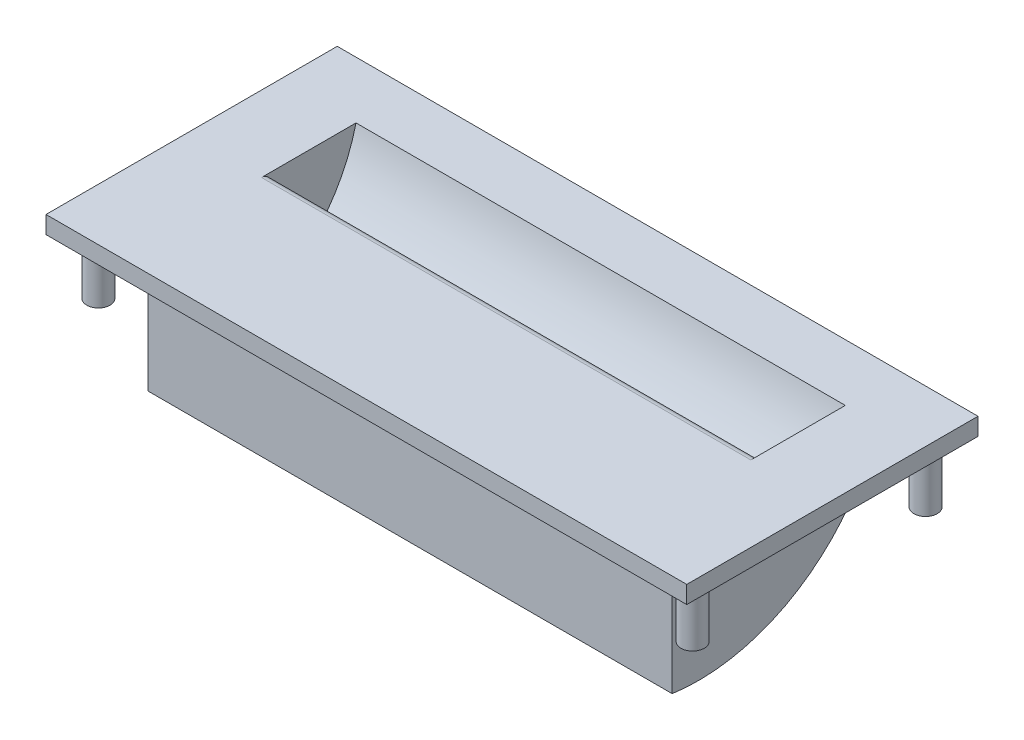
ISO-10303-21;
HEADER;
FILE_DESCRIPTION(('STEP AP214'),'2;1');
FILE_NAME('part.step','',(''),(''),'','','');
FILE_SCHEMA(('AUTOMOTIVE_DESIGN { 1 0 10303 214 1 1 1 1 }'));
ENDSEC;
DATA;
#1=APPLICATION_CONTEXT('core data for automotive mechanical design processes');
#2=APPLICATION_PROTOCOL_DEFINITION('international standard','automotive_design',2000,#1);
#3=PRODUCT_CONTEXT('',#1,'mechanical');
#4=PRODUCT('Part','Part','',(#3));
#5=PRODUCT_RELATED_PRODUCT_CATEGORY('part','',(#4));
#6=PRODUCT_DEFINITION_FORMATION('','',#4);
#7=PRODUCT_DEFINITION_CONTEXT('part definition',#1,'design');
#8=PRODUCT_DEFINITION('design','',#6,#7);
#9=PRODUCT_DEFINITION_SHAPE('','',#8);
#10=(LENGTH_UNIT() NAMED_UNIT(*) SI_UNIT(.MILLI.,.METRE.));
#11=(NAMED_UNIT(*) PLANE_ANGLE_UNIT() SI_UNIT($,.RADIAN.));
#12=(NAMED_UNIT(*) SI_UNIT($,.STERADIAN.) SOLID_ANGLE_UNIT());
#13=UNCERTAINTY_MEASURE_WITH_UNIT(LENGTH_MEASURE(1.E-05),#10,'distance_accuracy_value','');
#14=(GEOMETRIC_REPRESENTATION_CONTEXT(3) GLOBAL_UNCERTAINTY_ASSIGNED_CONTEXT((#13)) GLOBAL_UNIT_ASSIGNED_CONTEXT((#10,
#11,#12)) REPRESENTATION_CONTEXT('',''));
#15=CARTESIAN_POINT('',(0.,0.,0.));
#16=DIRECTION('',(0.,0.,1.));
#17=DIRECTION('',(1.,0.,0.));
#18=AXIS2_PLACEMENT_3D('',#15,#16,#17);
#19=CARTESIAN_POINT('',(-42.,3.,14.5));
#20=DIRECTION('',(0.,0.,1.));
#21=DIRECTION('',(1.,0.,0.));
#22=AXIS2_PLACEMENT_3D('',#19,#20,#21);
#23=PLANE('',#22);
#24=DIRECTION('',(-1.,0.,0.));
#25=VECTOR('',#24,1.);
#26=CARTESIAN_POINT('',(-42.,0.,14.5));
#27=LINE('',#26,#25);
#28=CARTESIAN_POINT('',(42.,0.,14.5));
#29=VERTEX_POINT('',#28);
#30=CARTESIAN_POINT('',(-42.,0.,14.5));
#31=VERTEX_POINT('',#30);
#32=EDGE_CURVE('E256',#29,#31,#27,.T.);
#33=ORIENTED_EDGE('',*,*,#32,.F.);
#34=DIRECTION('',(0.,-1.,0.));
#35=VECTOR('',#34,1.);
#36=CARTESIAN_POINT('',(42.,3.,14.5));
#37=LINE('',#36,#35);
#38=CARTESIAN_POINT('',(42.,-19.2791549046457,14.5));
#39=VERTEX_POINT('',#38);
#40=EDGE_CURVE('E149',#29,#39,#37,.T.);
#41=ORIENTED_EDGE('',*,*,#40,.T.);
#42=DIRECTION('',(1.,0.,0.));
#43=VECTOR('',#42,1.);
#44=CARTESIAN_POINT('',(-42.,-19.2791549046457,14.5));
#45=LINE('',#44,#43);
#46=CARTESIAN_POINT('',(-42.,-19.2791549046457,14.5));
#47=VERTEX_POINT('',#46);
#48=EDGE_CURVE('E142',#47,#39,#45,.T.);
#49=ORIENTED_EDGE('',*,*,#48,.F.);
#50=DIRECTION('',(0.,-1.,0.));
#51=VECTOR('',#50,1.);
#52=CARTESIAN_POINT('',(-42.,3.,14.5));
#53=LINE('',#52,#51);
#54=EDGE_CURVE('E143',#31,#47,#53,.T.);
#55=ORIENTED_EDGE('',*,*,#54,.F.);
#56=EDGE_LOOP('',(#33,#41,#49,#55));
#57=FACE_BOUND('',#56,.T.);
#58=ADVANCED_FACE('F36',(#57),#23,.F.);
#59=CARTESIAN_POINT('',(-42.,9.68203300391323,13.0001350310312));
#60=DIRECTION('',(1.,0.,0.));
#61=DIRECTION('',(0.,0.,-1.));
#62=AXIS2_PLACEMENT_3D('',#59,#60,#61);
#63=PLANE('',#62);
#64=CARTESIAN_POINT('',(-42.,1.5,1.));
#65=DIRECTION('',(1.,0.,0.));
#66=DIRECTION('',(0.,0.,-1.));
#67=AXIS2_PLACEMENT_3D('',#64,#65,#66);
#68=CIRCLE('',#67,1.5);
#69=CARTESIAN_POINT('',(-42.,3.,1.));
#70=VERTEX_POINT('',#69);
#71=CARTESIAN_POINT('',(-42.,1.5,-0.499999999999997));
#72=VERTEX_POINT('',#71);
#73=EDGE_CURVE('E52',#70,#72,#68,.F.);
#74=ORIENTED_EDGE('',*,*,#73,.T.);
#75=CARTESIAN_POINT('',(-42.,1.50000000000001,1.));
#76=DIRECTION('',(1.,0.,0.));
#77=DIRECTION('',(0.,0.,-1.));
#78=AXIS2_PLACEMENT_3D('',#75,#76,#77);
#79=CIRCLE('',#78,1.5);
#80=CARTESIAN_POINT('',(-42.,0.,1.));
#81=VERTEX_POINT('',#80);
#82=EDGE_CURVE('E45',#72,#81,#79,.F.);
#83=ORIENTED_EDGE('',*,*,#82,.T.);
#84=DIRECTION('',(0.,0.,1.));
#85=VECTOR('',#84,1.);
#86=CARTESIAN_POINT('',(-42.,0.,-0.499999999999997));
#87=LINE('',#86,#85);
#88=EDGE_CURVE('E248',#81,#31,#87,.T.);
#89=ORIENTED_EDGE('',*,*,#88,.T.);
#90=ORIENTED_EDGE('',*,*,#54,.T.);
#91=CARTESIAN_POINT('',(-42.,9.68203300391323,13.0001350310312));
#92=DIRECTION('',(1.,0.,0.));
#93=DIRECTION('',(0.,0.,-1.));
#94=AXIS2_PLACEMENT_3D('',#91,#92,#93);
#95=CIRCLE('',#94,29.);
#96=CARTESIAN_POINT('',(-42.,3.,-15.2195466633929));
#97=VERTEX_POINT('',#96);
#98=EDGE_CURVE('E137',#47,#97,#95,.T.);
#99=ORIENTED_EDGE('',*,*,#98,.T.);
#100=DIRECTION('',(0.,0.,1.));
#101=VECTOR('',#100,1.);
#102=CARTESIAN_POINT('',(-42.,3.,-15.2195466633929));
#103=LINE('',#102,#101);
#104=EDGE_CURVE('E146',#97,#70,#103,.T.);
#105=ORIENTED_EDGE('',*,*,#104,.T.);
#106=EDGE_LOOP('',(#74,#83,#89,#90,#99,#105));
#107=FACE_BOUND('',#106,.T.);
#108=ADVANCED_FACE('F145',(#107),#63,.T.);
#109=CARTESIAN_POINT('',(42.,9.68203300391323,13.0001350310312));
#110=DIRECTION('',(1.,0.,0.));
#111=DIRECTION('',(0.,0.,-1.));
#112=AXIS2_PLACEMENT_3D('',#109,#110,#111);
#113=PLANE('',#112);
#114=DIRECTION('',(0.,0.,1.));
#115=VECTOR('',#114,1.);
#116=CARTESIAN_POINT('',(42.,0.,-0.499999999999997));
#117=LINE('',#116,#115);
#118=CARTESIAN_POINT('',(42.,0.,1.));
#119=VERTEX_POINT('',#118);
#120=EDGE_CURVE('E161',#119,#29,#117,.T.);
#121=ORIENTED_EDGE('',*,*,#120,.F.);
#122=CARTESIAN_POINT('',(42.,1.5,1.));
#123=DIRECTION('',(1.,0.,0.));
#124=DIRECTION('',(0.,0.,-1.));
#125=AXIS2_PLACEMENT_3D('',#122,#123,#124);
#126=CIRCLE('',#125,1.5);
#127=CARTESIAN_POINT('',(42.,1.5,-0.499999999999997));
#128=VERTEX_POINT('',#127);
#129=EDGE_CURVE('E11',#119,#128,#126,.T.);
#130=ORIENTED_EDGE('',*,*,#129,.T.);
#131=CARTESIAN_POINT('',(42.,1.5,1.));
#132=DIRECTION('',(1.,0.,0.));
#133=DIRECTION('',(0.,0.,-1.));
#134=AXIS2_PLACEMENT_3D('',#131,#132,#133);
#135=CIRCLE('',#134,1.5);
#136=CARTESIAN_POINT('',(42.,3.,1.));
#137=VERTEX_POINT('',#136);
#138=EDGE_CURVE('E244',#128,#137,#135,.T.);
#139=ORIENTED_EDGE('',*,*,#138,.T.);
#140=DIRECTION('',(0.,0.,1.));
#141=VECTOR('',#140,1.);
#142=CARTESIAN_POINT('',(42.,3.,-15.2195466633929));
#143=LINE('',#142,#141);
#144=CARTESIAN_POINT('',(42.,3.,-15.2195466633929));
#145=VERTEX_POINT('',#144);
#146=EDGE_CURVE('E160',#145,#137,#143,.T.);
#147=ORIENTED_EDGE('',*,*,#146,.F.);
#148=CARTESIAN_POINT('',(42.,9.68203300391323,13.0001350310312));
#149=DIRECTION('',(1.,0.,0.));
#150=DIRECTION('',(0.,0.,-1.));
#151=AXIS2_PLACEMENT_3D('',#148,#149,#150);
#152=CIRCLE('',#151,29.);
#153=EDGE_CURVE('E139',#39,#145,#152,.T.);
#154=ORIENTED_EDGE('',*,*,#153,.F.);
#155=ORIENTED_EDGE('',*,*,#40,.F.);
#156=EDGE_LOOP('',(#121,#130,#139,#147,#154,#155));
#157=FACE_BOUND('',#156,.T.);
#158=ADVANCED_FACE('F261',(#157),#113,.F.);
#159=CARTESIAN_POINT('',(0.,3.,0.));
#160=DIRECTION('',(0.,-1.,0.));
#161=DIRECTION('',(0.,0.,-1.));
#162=AXIS2_PLACEMENT_3D('',#159,#160,#161);
#163=PLANE('',#162);
#164=DIRECTION('',(0.,0.,-1.));
#165=VECTOR('',#164,1.);
#166=CARTESIAN_POINT('',(55.,3.,25.));
#167=LINE('',#166,#165);
#168=CARTESIAN_POINT('',(55.,3.,25.));
#169=VERTEX_POINT('',#168);
#170=CARTESIAN_POINT('',(55.,3.,-25.));
#171=VERTEX_POINT('',#170);
#172=EDGE_CURVE('E212',#169,#171,#167,.T.);
#173=ORIENTED_EDGE('',*,*,#172,.T.);
#174=DIRECTION('',(-1.,0.,0.));
#175=VECTOR('',#174,1.);
#176=CARTESIAN_POINT('',(-55.,3.,-25.));
#177=LINE('',#176,#175);
#178=CARTESIAN_POINT('',(-55.,3.,-25.));
#179=VERTEX_POINT('',#178);
#180=EDGE_CURVE('E215',#171,#179,#177,.T.);
#181=ORIENTED_EDGE('',*,*,#180,.T.);
#182=DIRECTION('',(0.,0.,1.));
#183=VECTOR('',#182,1.);
#184=CARTESIAN_POINT('',(-55.,3.,25.));
#185=LINE('',#184,#183);
#186=CARTESIAN_POINT('',(-55.,3.,25.));
#187=VERTEX_POINT('',#186);
#188=EDGE_CURVE('E218',#179,#187,#185,.T.);
#189=ORIENTED_EDGE('',*,*,#188,.T.);
#190=DIRECTION('',(1.,0.,0.));
#191=VECTOR('',#190,1.);
#192=CARTESIAN_POINT('',(-55.,3.,25.));
#193=LINE('',#192,#191);
#194=EDGE_CURVE('E220',#187,#169,#193,.T.);
#195=ORIENTED_EDGE('',*,*,#194,.T.);
#196=EDGE_LOOP('',(#173,#181,#189,#195));
#197=FACE_BOUND('',#196,.T.);
#198=ORIENTED_EDGE('',*,*,#146,.T.);
#199=DIRECTION('',(1.,0.,0.));
#200=VECTOR('',#199,1.);
#201=CARTESIAN_POINT('',(0.,3.,1.));
#202=LINE('',#201,#200);
#203=EDGE_CURVE('E154',#137,#70,#202,.F.);
#204=ORIENTED_EDGE('',*,*,#203,.T.);
#205=ORIENTED_EDGE('',*,*,#104,.F.);
#206=DIRECTION('',(1.,0.,0.));
#207=VECTOR('',#206,1.);
#208=CARTESIAN_POINT('',(-42.,3.,-15.2195466633929));
#209=LINE('',#208,#207);
#210=EDGE_CURVE('E133',#97,#145,#209,.T.);
#211=ORIENTED_EDGE('',*,*,#210,.T.);
#212=EDGE_LOOP('',(#198,#204,#205,#211));
#213=FACE_BOUND('',#212,.T.);
#214=ADVANCED_FACE('F152',(#197,#213),#163,.F.);
#215=CARTESIAN_POINT('',(55.,3.,25.));
#216=DIRECTION('',(-1.,0.,0.));
#217=DIRECTION('',(0.,0.,1.));
#218=AXIS2_PLACEMENT_3D('',#215,#216,#217);
#219=PLANE('',#218);
#220=DIRECTION('',(0.,0.,-1.));
#221=VECTOR('',#220,1.);
#222=CARTESIAN_POINT('',(55.,0.,25.));
#223=LINE('',#222,#221);
#224=CARTESIAN_POINT('',(55.,0.,25.));
#225=VERTEX_POINT('',#224);
#226=CARTESIAN_POINT('',(55.,0.,-25.));
#227=VERTEX_POINT('',#226);
#228=EDGE_CURVE('E211',#225,#227,#223,.T.);
#229=ORIENTED_EDGE('',*,*,#228,.T.);
#230=DIRECTION('',(0.,-1.,0.));
#231=VECTOR('',#230,1.);
#232=CARTESIAN_POINT('',(55.,3.,-25.));
#233=LINE('',#232,#231);
#234=EDGE_CURVE('E238',#171,#227,#233,.T.);
#235=ORIENTED_EDGE('',*,*,#234,.F.);
#236=ORIENTED_EDGE('',*,*,#172,.F.);
#237=DIRECTION('',(0.,-1.,0.));
#238=VECTOR('',#237,1.);
#239=CARTESIAN_POINT('',(55.,3.,25.));
#240=LINE('',#239,#238);
#241=EDGE_CURVE('E222',#169,#225,#240,.T.);
#242=ORIENTED_EDGE('',*,*,#241,.T.);
#243=EDGE_LOOP('',(#229,#235,#236,#242));
#244=FACE_BOUND('',#243,.T.);
#245=ADVANCED_FACE('F326',(#244),#219,.F.);
#246=CARTESIAN_POINT('',(-55.,3.,-25.));
#247=DIRECTION('',(0.,0.,1.));
#248=DIRECTION('',(1.,0.,0.));
#249=AXIS2_PLACEMENT_3D('',#246,#247,#248);
#250=PLANE('',#249);
#251=DIRECTION('',(-1.,0.,0.));
#252=VECTOR('',#251,1.);
#253=CARTESIAN_POINT('',(-55.,0.,-25.));
#254=LINE('',#253,#252);
#255=CARTESIAN_POINT('',(-55.,0.,-25.));
#256=VERTEX_POINT('',#255);
#257=EDGE_CURVE('E225',#227,#256,#254,.T.);
#258=ORIENTED_EDGE('',*,*,#257,.T.);
#259=DIRECTION('',(0.,-1.,0.));
#260=VECTOR('',#259,1.);
#261=CARTESIAN_POINT('',(-55.,3.,-25.));
#262=LINE('',#261,#260);
#263=EDGE_CURVE('E235',#179,#256,#262,.T.);
#264=ORIENTED_EDGE('',*,*,#263,.F.);
#265=ORIENTED_EDGE('',*,*,#180,.F.);
#266=ORIENTED_EDGE('',*,*,#234,.T.);
#267=EDGE_LOOP('',(#258,#264,#265,#266));
#268=FACE_BOUND('',#267,.T.);
#269=ADVANCED_FACE('F338',(#268),#250,.F.);
#270=CARTESIAN_POINT('',(-55.,3.,25.));
#271=DIRECTION('',(1.,0.,0.));
#272=DIRECTION('',(0.,0.,-1.));
#273=AXIS2_PLACEMENT_3D('',#270,#271,#272);
#274=PLANE('',#273);
#275=DIRECTION('',(0.,0.,1.));
#276=VECTOR('',#275,1.);
#277=CARTESIAN_POINT('',(-55.,0.,25.));
#278=LINE('',#277,#276);
#279=CARTESIAN_POINT('',(-55.,0.,25.));
#280=VERTEX_POINT('',#279);
#281=EDGE_CURVE('E227',#256,#280,#278,.T.);
#282=ORIENTED_EDGE('',*,*,#281,.T.);
#283=DIRECTION('',(0.,-1.,0.));
#284=VECTOR('',#283,1.);
#285=CARTESIAN_POINT('',(-55.,3.,25.));
#286=LINE('',#285,#284);
#287=EDGE_CURVE('E232',#187,#280,#286,.T.);
#288=ORIENTED_EDGE('',*,*,#287,.F.);
#289=ORIENTED_EDGE('',*,*,#188,.F.);
#290=ORIENTED_EDGE('',*,*,#263,.T.);
#291=EDGE_LOOP('',(#282,#288,#289,#290));
#292=FACE_BOUND('',#291,.T.);
#293=ADVANCED_FACE('F334',(#292),#274,.F.);
#294=CARTESIAN_POINT('',(-55.,3.,25.));
#295=DIRECTION('',(0.,0.,-1.));
#296=DIRECTION('',(-1.,0.,0.));
#297=AXIS2_PLACEMENT_3D('',#294,#295,#296);
#298=PLANE('',#297);
#299=DIRECTION('',(1.,0.,0.));
#300=VECTOR('',#299,1.);
#301=CARTESIAN_POINT('',(-55.,0.,25.));
#302=LINE('',#301,#300);
#303=EDGE_CURVE('E216',#280,#225,#302,.T.);
#304=ORIENTED_EDGE('',*,*,#303,.T.);
#305=ORIENTED_EDGE('',*,*,#241,.F.);
#306=ORIENTED_EDGE('',*,*,#194,.F.);
#307=ORIENTED_EDGE('',*,*,#287,.T.);
#308=EDGE_LOOP('',(#304,#305,#306,#307));
#309=FACE_BOUND('',#308,.T.);
#310=ADVANCED_FACE('F330',(#309),#298,.F.);
#311=CARTESIAN_POINT('',(0.,0.,0.));
#312=DIRECTION('',(0.,-1.,0.));
#313=DIRECTION('',(0.,0.,-1.));
#314=AXIS2_PLACEMENT_3D('',#311,#312,#313);
#315=PLANE('',#314);
#316=CARTESIAN_POINT('',(51.,0.,-20.));
#317=DIRECTION('',(0.,-1.,0.));
#318=DIRECTION('',(0.,0.,-1.));
#319=AXIS2_PLACEMENT_3D('',#316,#317,#318);
#320=CIRCLE('',#319,2.);
#321=CARTESIAN_POINT('',(51.,0.,-22.));
#322=VERTEX_POINT('',#321);
#323=EDGE_CURVE('E164',#322,#322,#320,.T.);
#324=ORIENTED_EDGE('',*,*,#323,.F.);
#325=EDGE_LOOP('',(#324));
#326=FACE_BOUND('',#325,.T.);
#327=CARTESIAN_POINT('',(51.,0.,20.));
#328=DIRECTION('',(0.,-1.,0.));
#329=DIRECTION('',(0.,0.,1.));
#330=AXIS2_PLACEMENT_3D('',#327,#328,#329);
#331=CIRCLE('',#330,2.00000000000002);
#332=CARTESIAN_POINT('',(51.,0.,22.));
#333=VERTEX_POINT('',#332);
#334=EDGE_CURVE('E169',#333,#333,#331,.T.);
#335=ORIENTED_EDGE('',*,*,#334,.F.);
#336=EDGE_LOOP('',(#335));
#337=FACE_BOUND('',#336,.T.);
#338=CARTESIAN_POINT('',(-51.,0.,-20.));
#339=DIRECTION('',(0.,-1.,0.));
#340=DIRECTION('',(0.,0.,1.));
#341=AXIS2_PLACEMENT_3D('',#338,#339,#340);
#342=CIRCLE('',#341,2.);
#343=CARTESIAN_POINT('',(-51.,0.,-18.));
#344=VERTEX_POINT('',#343);
#345=EDGE_CURVE('E175',#344,#344,#342,.T.);
#346=ORIENTED_EDGE('',*,*,#345,.F.);
#347=EDGE_LOOP('',(#346));
#348=FACE_BOUND('',#347,.T.);
#349=CARTESIAN_POINT('',(-51.,0.,20.));
#350=DIRECTION('',(0.,-1.,0.));
#351=DIRECTION('',(0.,0.,-1.));
#352=AXIS2_PLACEMENT_3D('',#349,#350,#351);
#353=CIRCLE('',#352,2.);
#354=CARTESIAN_POINT('',(-51.,0.,18.));
#355=VERTEX_POINT('',#354);
#356=EDGE_CURVE('E181',#355,#355,#353,.T.);
#357=ORIENTED_EDGE('',*,*,#356,.F.);
#358=EDGE_LOOP('',(#357));
#359=FACE_BOUND('',#358,.T.);
#360=DIRECTION('',(0.,0.,1.));
#361=VECTOR('',#360,1.);
#362=CARTESIAN_POINT('',(45.,0.,-17.5));
#363=LINE('',#362,#361);
#364=CARTESIAN_POINT('',(45.,0.,-17.5));
#365=VERTEX_POINT('',#364);
#366=CARTESIAN_POINT('',(45.,0.,17.5));
#367=VERTEX_POINT('',#366);
#368=EDGE_CURVE('E190',#365,#367,#363,.T.);
#369=ORIENTED_EDGE('',*,*,#368,.F.);
#370=DIRECTION('',(-1.,0.,0.));
#371=VECTOR('',#370,1.);
#372=CARTESIAN_POINT('',(45.,0.,-17.5));
#373=LINE('',#372,#371);
#374=CARTESIAN_POINT('',(-45.,0.,-17.5));
#375=VERTEX_POINT('',#374);
#376=EDGE_CURVE('E198',#365,#375,#373,.T.);
#377=ORIENTED_EDGE('',*,*,#376,.T.);
#378=DIRECTION('',(0.,0.,1.));
#379=VECTOR('',#378,1.);
#380=CARTESIAN_POINT('',(-45.,0.,-17.5));
#381=LINE('',#380,#379);
#382=CARTESIAN_POINT('',(-45.,0.,17.5));
#383=VERTEX_POINT('',#382);
#384=EDGE_CURVE('E187',#375,#383,#381,.T.);
#385=ORIENTED_EDGE('',*,*,#384,.T.);
#386=DIRECTION('',(-1.,0.,0.));
#387=VECTOR('',#386,1.);
#388=CARTESIAN_POINT('',(45.,0.,17.5));
#389=LINE('',#388,#387);
#390=EDGE_CURVE('E209',#367,#383,#389,.T.);
#391=ORIENTED_EDGE('',*,*,#390,.F.);
#392=EDGE_LOOP('',(#369,#377,#385,#391));
#393=FACE_BOUND('',#392,.T.);
#394=ORIENTED_EDGE('',*,*,#228,.F.);
#395=ORIENTED_EDGE('',*,*,#303,.F.);
#396=ORIENTED_EDGE('',*,*,#281,.F.);
#397=ORIENTED_EDGE('',*,*,#257,.F.);
#398=EDGE_LOOP('',(#394,#395,#396,#397));
#399=FACE_BOUND('',#398,.T.);
#400=ADVANCED_FACE('F322',(#326,#337,#348,#359,#393,#399),#315,.T.);
#401=CARTESIAN_POINT('',(45.,0.,17.5));
#402=DIRECTION('',(0.,0.,-1.));
#403=DIRECTION('',(-1.,0.,0.));
#404=AXIS2_PLACEMENT_3D('',#401,#402,#403);
#405=PLANE('',#404);
#406=DIRECTION('',(0.,-1.,0.));
#407=VECTOR('',#406,1.);
#408=CARTESIAN_POINT('',(-45.,0.,17.5));
#409=LINE('',#408,#407);
#410=CARTESIAN_POINT('',(-45.,-22.,17.5));
#411=VERTEX_POINT('',#410);
#412=EDGE_CURVE('E201',#383,#411,#409,.T.);
#413=ORIENTED_EDGE('',*,*,#412,.T.);
#414=DIRECTION('',(-1.,0.,0.));
#415=VECTOR('',#414,1.);
#416=CARTESIAN_POINT('',(45.,-22.,17.5));
#417=LINE('',#416,#415);
#418=CARTESIAN_POINT('',(45.,-22.,17.5));
#419=VERTEX_POINT('',#418);
#420=EDGE_CURVE('E206',#419,#411,#417,.T.);
#421=ORIENTED_EDGE('',*,*,#420,.F.);
#422=DIRECTION('',(0.,-1.,0.));
#423=VECTOR('',#422,1.);
#424=CARTESIAN_POINT('',(45.,0.,17.5));
#425=LINE('',#424,#423);
#426=EDGE_CURVE('E193',#367,#419,#425,.T.);
#427=ORIENTED_EDGE('',*,*,#426,.F.);
#428=ORIENTED_EDGE('',*,*,#390,.T.);
#429=EDGE_LOOP('',(#413,#421,#427,#428));
#430=FACE_BOUND('',#429,.T.);
#431=ADVANCED_FACE('F318',(#430),#405,.F.);
#432=CARTESIAN_POINT('',(45.,9.68203300391323,13.0001350310312));
#433=DIRECTION('',(-1.,0.,0.));
#434=DIRECTION('',(0.,0.,1.));
#435=AXIS2_PLACEMENT_3D('',#432,#433,#434);
#436=CYLINDRICAL_SURFACE('',#435,32.);
#437=CARTESIAN_POINT('',(-45.,9.68203300391323,13.0001350310312));
#438=DIRECTION('',(1.,0.,0.));
#439=DIRECTION('',(0.,0.,-1.));
#440=AXIS2_PLACEMENT_3D('',#437,#438,#439);
#441=CIRCLE('',#440,32.);
#442=EDGE_CURVE('E194',#411,#375,#441,.T.);
#443=ORIENTED_EDGE('',*,*,#442,.T.);
#444=ORIENTED_EDGE('',*,*,#376,.F.);
#445=CARTESIAN_POINT('',(45.,9.68203300391323,13.0001350310312));
#446=DIRECTION('',(1.,0.,0.));
#447=DIRECTION('',(0.,0.,-1.));
#448=AXIS2_PLACEMENT_3D('',#445,#446,#447);
#449=CIRCLE('',#448,32.);
#450=EDGE_CURVE('E196',#419,#365,#449,.T.);
#451=ORIENTED_EDGE('',*,*,#450,.F.);
#452=ORIENTED_EDGE('',*,*,#420,.T.);
#453=EDGE_LOOP('',(#443,#444,#451,#452));
#454=FACE_BOUND('',#453,.T.);
#455=ADVANCED_FACE('F311',(#454),#436,.T.);
#456=CARTESIAN_POINT('',(45.,9.68203300391323,13.0001350310312));
#457=DIRECTION('',(1.,0.,0.));
#458=DIRECTION('',(0.,0.,-1.));
#459=AXIS2_PLACEMENT_3D('',#456,#457,#458);
#460=PLANE('',#459);
#461=ORIENTED_EDGE('',*,*,#368,.T.);
#462=ORIENTED_EDGE('',*,*,#426,.T.);
#463=ORIENTED_EDGE('',*,*,#450,.T.);
#464=EDGE_LOOP('',(#461,#462,#463));
#465=FACE_BOUND('',#464,.T.);
#466=ADVANCED_FACE('F308',(#465),#460,.T.);
#467=CARTESIAN_POINT('',(-45.,9.68203300391323,13.0001350310312));
#468=DIRECTION('',(1.,0.,0.));
#469=DIRECTION('',(0.,0.,-1.));
#470=AXIS2_PLACEMENT_3D('',#467,#468,#469);
#471=PLANE('',#470);
#472=ORIENTED_EDGE('',*,*,#384,.F.);
#473=ORIENTED_EDGE('',*,*,#442,.F.);
#474=ORIENTED_EDGE('',*,*,#412,.F.);
#475=EDGE_LOOP('',(#472,#473,#474));
#476=FACE_BOUND('',#475,.T.);
#477=ADVANCED_FACE('F306',(#476),#471,.F.);
#478=CARTESIAN_POINT('',(-51.,-10.,20.));
#479=DIRECTION('',(0.,1.,0.));
#480=DIRECTION('',(0.,0.,1.));
#481=AXIS2_PLACEMENT_3D('',#478,#479,#480);
#482=CYLINDRICAL_SURFACE('',#481,2.);
#483=CARTESIAN_POINT('',(-51.,-10.,20.));
#484=DIRECTION('',(0.,-1.,0.));
#485=DIRECTION('',(0.,0.,-1.));
#486=AXIS2_PLACEMENT_3D('',#483,#484,#485);
#487=CIRCLE('',#486,2.);
#488=CARTESIAN_POINT('',(-51.,-10.,18.));
#489=VERTEX_POINT('',#488);
#490=EDGE_CURVE('E184',#489,#489,#487,.T.);
#491=ORIENTED_EDGE('',*,*,#490,.F.);
#492=EDGE_LOOP('',(#491));
#493=FACE_BOUND('',#492,.T.);
#494=ORIENTED_EDGE('',*,*,#356,.T.);
#495=EDGE_LOOP('',(#494));
#496=FACE_BOUND('',#495,.T.);
#497=ADVANCED_FACE('F302',(#493,#496),#482,.T.);
#498=CARTESIAN_POINT('',(-51.,-10.,20.));
#499=DIRECTION('',(0.,-1.,0.));
#500=DIRECTION('',(0.,0.,-1.));
#501=AXIS2_PLACEMENT_3D('',#498,#499,#500);
#502=PLANE('',#501);
#503=ORIENTED_EDGE('',*,*,#490,.T.);
#504=EDGE_LOOP('',(#503));
#505=FACE_BOUND('',#504,.T.);
#506=ADVANCED_FACE('F298',(#505),#502,.T.);
#507=CARTESIAN_POINT('',(-51.,-10.,-20.));
#508=DIRECTION('',(0.,1.,0.));
#509=DIRECTION('',(0.,0.,1.));
#510=AXIS2_PLACEMENT_3D('',#507,#508,#509);
#511=CYLINDRICAL_SURFACE('',#510,2.);
#512=CARTESIAN_POINT('',(-51.,-10.,-20.));
#513=DIRECTION('',(0.,-1.,0.));
#514=DIRECTION('',(0.,0.,1.));
#515=AXIS2_PLACEMENT_3D('',#512,#513,#514);
#516=CIRCLE('',#515,2.);
#517=CARTESIAN_POINT('',(-51.,-10.,-18.));
#518=VERTEX_POINT('',#517);
#519=EDGE_CURVE('E178',#518,#518,#516,.T.);
#520=ORIENTED_EDGE('',*,*,#519,.F.);
#521=EDGE_LOOP('',(#520));
#522=FACE_BOUND('',#521,.T.);
#523=ORIENTED_EDGE('',*,*,#345,.T.);
#524=EDGE_LOOP('',(#523));
#525=FACE_BOUND('',#524,.T.);
#526=ADVANCED_FACE('F294',(#522,#525),#511,.T.);
#527=CARTESIAN_POINT('',(-51.,-10.,-20.));
#528=DIRECTION('',(0.,1.,0.));
#529=DIRECTION('',(0.,0.,1.));
#530=AXIS2_PLACEMENT_3D('',#527,#528,#529);
#531=PLANE('',#530);
#532=ORIENTED_EDGE('',*,*,#519,.T.);
#533=EDGE_LOOP('',(#532));
#534=FACE_BOUND('',#533,.T.);
#535=ADVANCED_FACE('F290',(#534),#531,.F.);
#536=CARTESIAN_POINT('',(51.,-10.,20.));
#537=DIRECTION('',(0.,1.,0.));
#538=DIRECTION('',(0.,0.,1.));
#539=AXIS2_PLACEMENT_3D('',#536,#537,#538);
#540=CYLINDRICAL_SURFACE('',#539,2.00000000000002);
#541=CARTESIAN_POINT('',(51.,-10.,20.));
#542=DIRECTION('',(0.,-1.,0.));
#543=DIRECTION('',(0.,0.,1.));
#544=AXIS2_PLACEMENT_3D('',#541,#542,#543);
#545=CIRCLE('',#544,2.00000000000002);
#546=CARTESIAN_POINT('',(51.,-10.,22.));
#547=VERTEX_POINT('',#546);
#548=EDGE_CURVE('E172',#547,#547,#545,.T.);
#549=ORIENTED_EDGE('',*,*,#548,.F.);
#550=EDGE_LOOP('',(#549));
#551=FACE_BOUND('',#550,.T.);
#552=ORIENTED_EDGE('',*,*,#334,.T.);
#553=EDGE_LOOP('',(#552));
#554=FACE_BOUND('',#553,.T.);
#555=ADVANCED_FACE('F286',(#551,#554),#540,.T.);
#556=CARTESIAN_POINT('',(51.,-10.,20.));
#557=DIRECTION('',(0.,1.,0.));
#558=DIRECTION('',(0.,0.,1.));
#559=AXIS2_PLACEMENT_3D('',#556,#557,#558);
#560=PLANE('',#559);
#561=ORIENTED_EDGE('',*,*,#548,.T.);
#562=EDGE_LOOP('',(#561));
#563=FACE_BOUND('',#562,.T.);
#564=ADVANCED_FACE('F282',(#563),#560,.F.);
#565=CARTESIAN_POINT('',(51.,-10.,-20.));
#566=DIRECTION('',(0.,1.,0.));
#567=DIRECTION('',(0.,0.,1.));
#568=AXIS2_PLACEMENT_3D('',#565,#566,#567);
#569=CYLINDRICAL_SURFACE('',#568,2.);
#570=CARTESIAN_POINT('',(51.,-10.,-20.));
#571=DIRECTION('',(0.,-1.,0.));
#572=DIRECTION('',(0.,0.,-1.));
#573=AXIS2_PLACEMENT_3D('',#570,#571,#572);
#574=CIRCLE('',#573,2.);
#575=CARTESIAN_POINT('',(51.,-10.,-22.));
#576=VERTEX_POINT('',#575);
#577=EDGE_CURVE('E166',#576,#576,#574,.T.);
#578=ORIENTED_EDGE('',*,*,#577,.F.);
#579=EDGE_LOOP('',(#578));
#580=FACE_BOUND('',#579,.T.);
#581=ORIENTED_EDGE('',*,*,#323,.T.);
#582=EDGE_LOOP('',(#581));
#583=FACE_BOUND('',#582,.T.);
#584=ADVANCED_FACE('F278',(#580,#583),#569,.T.);
#585=CARTESIAN_POINT('',(51.,-10.,-20.));
#586=DIRECTION('',(0.,-1.,0.));
#587=DIRECTION('',(0.,0.,-1.));
#588=AXIS2_PLACEMENT_3D('',#585,#586,#587);
#589=PLANE('',#588);
#590=ORIENTED_EDGE('',*,*,#577,.T.);
#591=EDGE_LOOP('',(#590));
#592=FACE_BOUND('',#591,.T.);
#593=ADVANCED_FACE('F275',(#592),#589,.T.);
#594=CARTESIAN_POINT('',(-42.,9.68203300391323,13.0001350310312));
#595=DIRECTION('',(1.,0.,0.));
#596=DIRECTION('',(0.,0.,-1.));
#597=AXIS2_PLACEMENT_3D('',#594,#595,#596);
#598=CYLINDRICAL_SURFACE('',#597,29.);
#599=ORIENTED_EDGE('',*,*,#153,.T.);
#600=ORIENTED_EDGE('',*,*,#210,.F.);
#601=ORIENTED_EDGE('',*,*,#98,.F.);
#602=ORIENTED_EDGE('',*,*,#48,.T.);
#603=EDGE_LOOP('',(#599,#600,#601,#602));
#604=FACE_BOUND('',#603,.T.);
#605=ADVANCED_FACE('F135',(#604),#598,.F.);
#606=CARTESIAN_POINT('',(-42.,0.,-0.499999999999997));
#607=DIRECTION('',(0.,1.,0.));
#608=DIRECTION('',(-1.,0.,0.));
#609=AXIS2_PLACEMENT_3D('',#606,#607,#608);
#610=PLANE('',#609);
#611=ORIENTED_EDGE('',*,*,#88,.F.);
#612=DIRECTION('',(-1.,0.,0.));
#613=VECTOR('',#612,1.);
#614=CARTESIAN_POINT('',(-42.,0.,1.));
#615=LINE('',#614,#613);
#616=EDGE_CURVE('E242',#81,#119,#615,.F.);
#617=ORIENTED_EDGE('',*,*,#616,.T.);
#618=ORIENTED_EDGE('',*,*,#120,.T.);
#619=ORIENTED_EDGE('',*,*,#32,.T.);
#620=EDGE_LOOP('',(#611,#617,#618,#619));
#621=FACE_BOUND('',#620,.T.);
#622=ADVANCED_FACE('F254',(#621),#610,.F.);
#623=CARTESIAN_POINT('',(0.,1.50000000000001,1.));
#624=DIRECTION('',(-1.,0.,0.));
#625=DIRECTION('',(0.,-1.,0.));
#626=AXIS2_PLACEMENT_3D('',#623,#624,#625);
#627=CYLINDRICAL_SURFACE('',#626,1.5);
#628=ORIENTED_EDGE('',*,*,#616,.F.);
#629=ORIENTED_EDGE('',*,*,#82,.F.);
#630=DIRECTION('',(-1.,0.,0.));
#631=VECTOR('',#630,1.);
#632=CARTESIAN_POINT('',(0.,1.50000000000001,-0.499999999999997));
#633=LINE('',#632,#631);
#634=EDGE_CURVE('E40',#128,#72,#633,.T.);
#635=ORIENTED_EDGE('',*,*,#634,.F.);
#636=ORIENTED_EDGE('',*,*,#129,.F.);
#637=EDGE_LOOP('',(#628,#629,#635,#636));
#638=FACE_BOUND('',#637,.T.);
#639=ADVANCED_FACE('F38',(#638),#627,.T.);
#640=CARTESIAN_POINT('',(0.,1.5,1.));
#641=DIRECTION('',(1.,0.,0.));
#642=DIRECTION('',(0.,0.,-1.));
#643=AXIS2_PLACEMENT_3D('',#640,#641,#642);
#644=CYLINDRICAL_SURFACE('',#643,1.5);
#645=ORIENTED_EDGE('',*,*,#73,.F.);
#646=ORIENTED_EDGE('',*,*,#203,.F.);
#647=ORIENTED_EDGE('',*,*,#138,.F.);
#648=ORIENTED_EDGE('',*,*,#634,.T.);
#649=EDGE_LOOP('',(#645,#646,#647,#648));
#650=FACE_BOUND('',#649,.T.);
#651=ADVANCED_FACE('F260',(#650),#644,.T.);
#652=CLOSED_SHELL('',(#58,#108,#158,#214,#245,#269,#293,#310,#400,#431,#455,#466,#477,#497,#506,
#526,#535,#555,#564,#584,#593,#605,#622,#639,#651));
#653=MANIFOLD_SOLID_BREP('B2',#652);
#654=ADVANCED_BREP_SHAPE_REPRESENTATION('',(#18,#653),#14);
#655=SHAPE_DEFINITION_REPRESENTATION(#9,#654);
ENDSEC;
END-ISO-10303-21;
